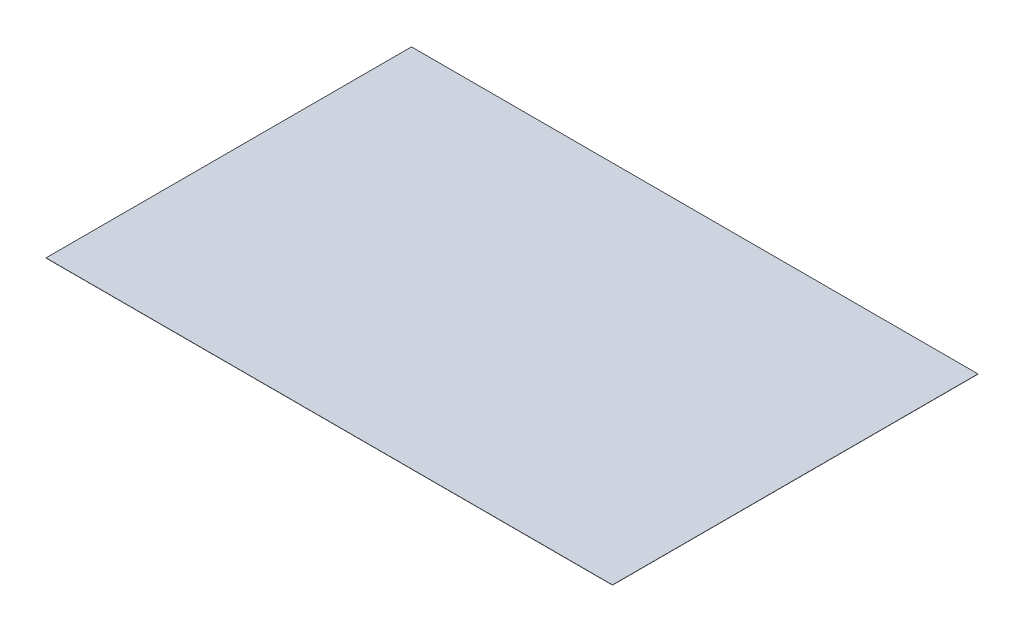
ISO-10303-21;
HEADER;
FILE_DESCRIPTION(('STEP AP214'),'2;1');
FILE_NAME('part.step','',(''),(''),'','','');
FILE_SCHEMA(('AUTOMOTIVE_DESIGN { 1 0 10303 214 1 1 1 1 }'));
ENDSEC;
DATA;
#1=APPLICATION_CONTEXT('core data for automotive mechanical design processes');
#2=APPLICATION_PROTOCOL_DEFINITION('international standard','automotive_design',2000,#1);
#3=PRODUCT_CONTEXT('',#1,'mechanical');
#4=PRODUCT('Part','Part','',(#3));
#5=PRODUCT_RELATED_PRODUCT_CATEGORY('part','',(#4));
#6=PRODUCT_DEFINITION_FORMATION('','',#4);
#7=PRODUCT_DEFINITION_CONTEXT('part definition',#1,'design');
#8=PRODUCT_DEFINITION('design','',#6,#7);
#9=PRODUCT_DEFINITION_SHAPE('','',#8);
#10=(LENGTH_UNIT() NAMED_UNIT(*) SI_UNIT(.MILLI.,.METRE.));
#11=(NAMED_UNIT(*) PLANE_ANGLE_UNIT() SI_UNIT($,.RADIAN.));
#12=(NAMED_UNIT(*) SI_UNIT($,.STERADIAN.) SOLID_ANGLE_UNIT());
#13=UNCERTAINTY_MEASURE_WITH_UNIT(LENGTH_MEASURE(1.E-05),#10,'distance_accuracy_value','');
#14=(GEOMETRIC_REPRESENTATION_CONTEXT(3) GLOBAL_UNCERTAINTY_ASSIGNED_CONTEXT((#13)) GLOBAL_UNIT_ASSIGNED_CONTEXT((#10,
#11,#12)) REPRESENTATION_CONTEXT('',''));
#15=CARTESIAN_POINT('',(0.,0.,0.));
#16=DIRECTION('',(0.,0.,1.));
#17=DIRECTION('',(1.,0.,0.));
#18=AXIS2_PLACEMENT_3D('',#15,#16,#17);
#19=CARTESIAN_POINT('',(-1550.,1.,-1000.));
#20=DIRECTION('',(1.,0.,0.));
#21=DIRECTION('',(0.,0.,-1.));
#22=AXIS2_PLACEMENT_3D('',#19,#20,#21);
#23=PLANE('',#22);
#24=DIRECTION('',(0.,0.,1.));
#25=VECTOR('',#24,1.);
#26=CARTESIAN_POINT('',(-1550.,0.,-1000.));
#27=LINE('',#26,#25);
#28=CARTESIAN_POINT('',(-1550.,0.,-1000.));
#29=VERTEX_POINT('',#28);
#30=CARTESIAN_POINT('',(-1550.,0.,1000.));
#31=VERTEX_POINT('',#30);
#32=EDGE_CURVE('E113',#29,#31,#27,.T.);
#33=ORIENTED_EDGE('',*,*,#32,.T.);
#34=DIRECTION('',(0.,-1.,0.));
#35=VECTOR('',#34,1.);
#36=CARTESIAN_POINT('',(-1550.,1.,1000.));
#37=LINE('',#36,#35);
#38=CARTESIAN_POINT('',(-1550.,1.,1000.));
#39=VERTEX_POINT('',#38);
#40=EDGE_CURVE('E11',#39,#31,#37,.T.);
#41=ORIENTED_EDGE('',*,*,#40,.F.);
#42=DIRECTION('',(0.,0.,1.));
#43=VECTOR('',#42,1.);
#44=CARTESIAN_POINT('',(-1550.,1.,-1000.));
#45=LINE('',#44,#43);
#46=CARTESIAN_POINT('',(-1550.,1.,-1000.));
#47=VERTEX_POINT('',#46);
#48=EDGE_CURVE('E97',#47,#39,#45,.T.);
#49=ORIENTED_EDGE('',*,*,#48,.F.);
#50=DIRECTION('',(0.,-1.,0.));
#51=VECTOR('',#50,1.);
#52=CARTESIAN_POINT('',(-1550.,1.,-1000.));
#53=LINE('',#52,#51);
#54=EDGE_CURVE('E109',#47,#29,#53,.T.);
#55=ORIENTED_EDGE('',*,*,#54,.T.);
#56=EDGE_LOOP('',(#33,#41,#49,#55));
#57=FACE_BOUND('',#56,.T.);
#58=ADVANCED_FACE('F45',(#57),#23,.F.);
#59=CARTESIAN_POINT('',(1550.,1.,1000.));
#60=DIRECTION('',(0.,0.,-1.));
#61=DIRECTION('',(-1.,0.,0.));
#62=AXIS2_PLACEMENT_3D('',#59,#60,#61);
#63=PLANE('',#62);
#64=DIRECTION('',(1.,0.,0.));
#65=VECTOR('',#64,1.);
#66=CARTESIAN_POINT('',(1550.,0.,1000.));
#67=LINE('',#66,#65);
#68=CARTESIAN_POINT('',(1550.,0.,1000.));
#69=VERTEX_POINT('',#68);
#70=EDGE_CURVE('E102',#31,#69,#67,.T.);
#71=ORIENTED_EDGE('',*,*,#70,.T.);
#72=DIRECTION('',(0.,-1.,0.));
#73=VECTOR('',#72,1.);
#74=CARTESIAN_POINT('',(1550.,1.,1000.));
#75=LINE('',#74,#73);
#76=CARTESIAN_POINT('',(1550.,1.,1000.));
#77=VERTEX_POINT('',#76);
#78=EDGE_CURVE('E54',#77,#69,#75,.T.);
#79=ORIENTED_EDGE('',*,*,#78,.F.);
#80=DIRECTION('',(1.,0.,0.));
#81=VECTOR('',#80,1.);
#82=CARTESIAN_POINT('',(1550.,1.,1000.));
#83=LINE('',#82,#81);
#84=EDGE_CURVE('E92',#39,#77,#83,.T.);
#85=ORIENTED_EDGE('',*,*,#84,.F.);
#86=ORIENTED_EDGE('',*,*,#40,.T.);
#87=EDGE_LOOP('',(#71,#79,#85,#86));
#88=FACE_BOUND('',#87,.T.);
#89=ADVANCED_FACE('F101',(#88),#63,.F.);
#90=CARTESIAN_POINT('',(1550.,1.,-1000.));
#91=DIRECTION('',(-1.,0.,0.));
#92=DIRECTION('',(0.,0.,1.));
#93=AXIS2_PLACEMENT_3D('',#90,#91,#92);
#94=PLANE('',#93);
#95=DIRECTION('',(0.,0.,-1.));
#96=VECTOR('',#95,1.);
#97=CARTESIAN_POINT('',(1550.,0.,-1000.));
#98=LINE('',#97,#96);
#99=CARTESIAN_POINT('',(1550.,0.,-1000.));
#100=VERTEX_POINT('',#99);
#101=EDGE_CURVE('E79',#69,#100,#98,.T.);
#102=ORIENTED_EDGE('',*,*,#101,.T.);
#103=DIRECTION('',(0.,-1.,0.));
#104=VECTOR('',#103,1.);
#105=CARTESIAN_POINT('',(1550.,1.,-1000.));
#106=LINE('',#105,#104);
#107=CARTESIAN_POINT('',(1550.,1.,-1000.));
#108=VERTEX_POINT('',#107);
#109=EDGE_CURVE('E104',#108,#100,#106,.T.);
#110=ORIENTED_EDGE('',*,*,#109,.F.);
#111=DIRECTION('',(0.,0.,-1.));
#112=VECTOR('',#111,1.);
#113=CARTESIAN_POINT('',(1550.,1.,-1000.));
#114=LINE('',#113,#112);
#115=EDGE_CURVE('E95',#77,#108,#114,.T.);
#116=ORIENTED_EDGE('',*,*,#115,.F.);
#117=ORIENTED_EDGE('',*,*,#78,.T.);
#118=EDGE_LOOP('',(#102,#110,#116,#117));
#119=FACE_BOUND('',#118,.T.);
#120=ADVANCED_FACE('F105',(#119),#94,.F.);
#121=CARTESIAN_POINT('',(1550.,1.,-1000.));
#122=DIRECTION('',(0.,0.,1.));
#123=DIRECTION('',(1.,0.,0.));
#124=AXIS2_PLACEMENT_3D('',#121,#122,#123);
#125=PLANE('',#124);
#126=DIRECTION('',(-1.,0.,0.));
#127=VECTOR('',#126,1.);
#128=CARTESIAN_POINT('',(1550.,0.,-1000.));
#129=LINE('',#128,#127);
#130=EDGE_CURVE('E85',#100,#29,#129,.T.);
#131=ORIENTED_EDGE('',*,*,#130,.T.);
#132=ORIENTED_EDGE('',*,*,#54,.F.);
#133=DIRECTION('',(-1.,0.,0.));
#134=VECTOR('',#133,1.);
#135=CARTESIAN_POINT('',(1550.,1.,-1000.));
#136=LINE('',#135,#134);
#137=EDGE_CURVE('E62',#108,#47,#136,.T.);
#138=ORIENTED_EDGE('',*,*,#137,.F.);
#139=ORIENTED_EDGE('',*,*,#109,.T.);
#140=EDGE_LOOP('',(#131,#132,#138,#139));
#141=FACE_BOUND('',#140,.T.);
#142=ADVANCED_FACE('F126',(#141),#125,.F.);
#143=CARTESIAN_POINT('',(0.,1.,0.));
#144=DIRECTION('',(0.,-1.,0.));
#145=DIRECTION('',(0.,0.,-1.));
#146=AXIS2_PLACEMENT_3D('',#143,#144,#145);
#147=PLANE('',#146);
#148=ORIENTED_EDGE('',*,*,#48,.T.);
#149=ORIENTED_EDGE('',*,*,#84,.T.);
#150=ORIENTED_EDGE('',*,*,#115,.T.);
#151=ORIENTED_EDGE('',*,*,#137,.T.);
#152=EDGE_LOOP('',(#148,#149,#150,#151));
#153=FACE_BOUND('',#152,.T.);
#154=ADVANCED_FACE('F93',(#153),#147,.F.);
#155=CARTESIAN_POINT('',(0.,0.,0.));
#156=DIRECTION('',(0.,-1.,0.));
#157=DIRECTION('',(0.,0.,-1.));
#158=AXIS2_PLACEMENT_3D('',#155,#156,#157);
#159=PLANE('',#158);
#160=ORIENTED_EDGE('',*,*,#32,.F.);
#161=ORIENTED_EDGE('',*,*,#130,.F.);
#162=ORIENTED_EDGE('',*,*,#101,.F.);
#163=ORIENTED_EDGE('',*,*,#70,.F.);
#164=EDGE_LOOP('',(#160,#161,#162,#163));
#165=FACE_BOUND('',#164,.T.);
#166=ADVANCED_FACE('F129',(#165),#159,.T.);
#167=CLOSED_SHELL('',(#58,#89,#120,#142,#154,#166));
#168=MANIFOLD_SOLID_BREP('B2',#167);
#169=ADVANCED_BREP_SHAPE_REPRESENTATION('',(#18,#168),#14);
#170=SHAPE_DEFINITION_REPRESENTATION(#9,#169);
ENDSEC;
END-ISO-10303-21;
